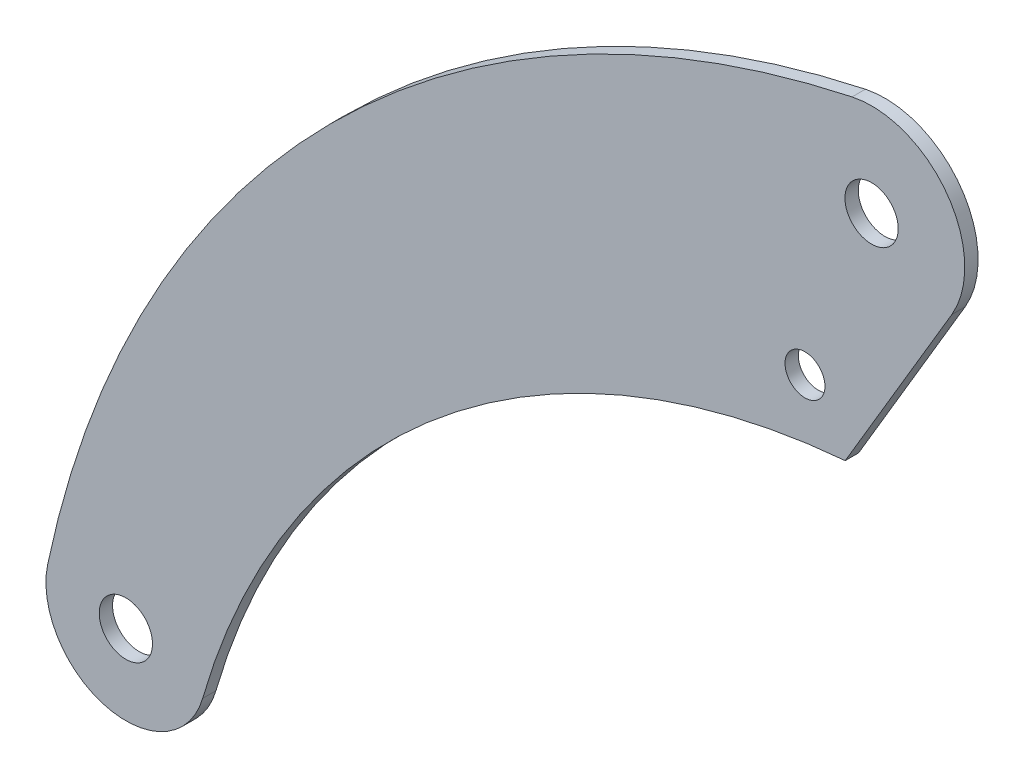
ISO-10303-21;
HEADER;
FILE_DESCRIPTION(('STEP AP214'),'2;1');
FILE_NAME('part.step','',(''),(''),'','','');
FILE_SCHEMA(('AUTOMOTIVE_DESIGN { 1 0 10303 214 1 1 1 1 }'));
ENDSEC;
DATA;
#1=APPLICATION_CONTEXT('core data for automotive mechanical design processes');
#2=APPLICATION_PROTOCOL_DEFINITION('international standard','automotive_design',2000,#1);
#3=PRODUCT_CONTEXT('',#1,'mechanical');
#4=PRODUCT('Part','Part','',(#3));
#5=PRODUCT_RELATED_PRODUCT_CATEGORY('part','',(#4));
#6=PRODUCT_DEFINITION_FORMATION('','',#4);
#7=PRODUCT_DEFINITION_CONTEXT('part definition',#1,'design');
#8=PRODUCT_DEFINITION('design','',#6,#7);
#9=PRODUCT_DEFINITION_SHAPE('','',#8);
#10=(LENGTH_UNIT() NAMED_UNIT(*) SI_UNIT(.MILLI.,.METRE.));
#11=(NAMED_UNIT(*) PLANE_ANGLE_UNIT() SI_UNIT($,.RADIAN.));
#12=(NAMED_UNIT(*) SI_UNIT($,.STERADIAN.) SOLID_ANGLE_UNIT());
#13=UNCERTAINTY_MEASURE_WITH_UNIT(LENGTH_MEASURE(1.E-05),#10,'distance_accuracy_value','');
#14=(GEOMETRIC_REPRESENTATION_CONTEXT(3) GLOBAL_UNCERTAINTY_ASSIGNED_CONTEXT((#13)) GLOBAL_UNIT_ASSIGNED_CONTEXT((#10,
#11,#12)) REPRESENTATION_CONTEXT('',''));
#15=CARTESIAN_POINT('',(0.,0.,0.));
#16=DIRECTION('',(0.,0.,1.));
#17=DIRECTION('',(1.,0.,0.));
#18=AXIS2_PLACEMENT_3D('',#15,#16,#17);
#19=CARTESIAN_POINT('',(149.481823007681,-699.199674335093,5.));
#20=DIRECTION('',(0.,0.,1.));
#21=DIRECTION('',(1.,0.,0.));
#22=AXIS2_PLACEMENT_3D('',#19,#20,#21);
#23=PLANE('',#22);
#24=CARTESIAN_POINT('',(-50.,-130.,5.));
#25=DIRECTION('',(0.,0.,1.));
#26=DIRECTION('',(1.,0.,0.));
#27=AXIS2_PLACEMENT_3D('',#24,#25,#26);
#28=CIRCLE('',#27,15.);
#29=CARTESIAN_POINT('',(-35.,-130.,5.));
#30=VERTEX_POINT('',#29);
#31=EDGE_CURVE('E173',#30,#30,#28,.T.);
#32=ORIENTED_EDGE('',*,*,#31,.F.);
#33=EDGE_LOOP('',(#32));
#34=FACE_BOUND('',#33,.T.);
#35=CARTESIAN_POINT('',(149.481823007681,-699.199674335093,5.));
#36=DIRECTION('',(0.,0.,1.));
#37=DIRECTION('',(1.,0.,0.));
#38=AXIS2_PLACEMENT_3D('',#35,#36,#37);
#39=CIRCLE('',#38,785.);
#40=CARTESIAN_POINT('',(-14.634584070682,68.4531149698693,5.));
#41=VERTEX_POINT('',#40);
#42=CARTESIAN_POINT('',(-618.715737076498,-537.652440744682,5.));
#43=VERTEX_POINT('',#42);
#44=EDGE_CURVE('E123',#41,#43,#39,.T.);
#45=ORIENTED_EDGE('',*,*,#44,.T.);
#46=CARTESIAN_POINT('',(-560.,-550.,5.));
#47=DIRECTION('',(0.,0.,1.));
#48=DIRECTION('',(1.,0.,0.));
#49=AXIS2_PLACEMENT_3D('',#46,#47,#48);
#50=CIRCLE('',#49,60.);
#51=CARTESIAN_POINT('',(-502.341900982989,-566.599506551236,5.));
#52=VERTEX_POINT('',#51);
#53=EDGE_CURVE('E90',#43,#52,#50,.T.);
#54=ORIENTED_EDGE('',*,*,#53,.T.);
#55=CARTESIAN_POINT('',(26.1906733396146,-718.761649937565,5.));
#56=DIRECTION('',(0.,0.,-1.));
#57=DIRECTION('',(1.,0.,0.));
#58=AXIS2_PLACEMENT_3D('',#55,#56,#57);
#59=CIRCLE('',#58,550.);
#60=CARTESIAN_POINT('',(-19.7795926456078,-170.686167321121,5.));
#61=VERTEX_POINT('',#60);
#62=EDGE_CURVE('E94',#52,#61,#59,.T.);
#63=ORIENTED_EDGE('',*,*,#62,.T.);
#64=DIRECTION('',(0.509802390301733,0.860291533634174,0.));
#65=VECTOR('',#64,1.);
#66=CARTESIAN_POINT('',(60.2204073543922,-35.6861673211213,5.));
#67=LINE('',#66,#65);
#68=CARTESIAN_POINT('',(60.2204073543922,-35.6861673211213,5.));
#69=VERTEX_POINT('',#68);
#70=EDGE_CURVE('E98',#61,#69,#67,.T.);
#71=ORIENTED_EDGE('',*,*,#70,.T.);
#72=CARTESIAN_POINT('',(0.,0.,5.));
#73=DIRECTION('',(0.,0.,1.));
#74=DIRECTION('',(-1.,0.,0.));
#75=AXIS2_PLACEMENT_3D('',#72,#73,#74);
#76=CIRCLE('',#75,70.);
#77=EDGE_CURVE('E56',#69,#41,#76,.T.);
#78=ORIENTED_EDGE('',*,*,#77,.T.);
#79=EDGE_LOOP('',(#45,#54,#63,#71,#78));
#80=FACE_BOUND('',#79,.T.);
#81=CARTESIAN_POINT('',(0.,0.,5.));
#82=DIRECTION('',(0.,0.,1.));
#83=DIRECTION('',(1.,0.,0.));
#84=AXIS2_PLACEMENT_3D('',#81,#82,#83);
#85=CIRCLE('',#84,20.);
#86=CARTESIAN_POINT('',(20.,0.,5.));
#87=VERTEX_POINT('',#86);
#88=EDGE_CURVE('E118',#87,#87,#85,.T.);
#89=ORIENTED_EDGE('',*,*,#88,.F.);
#90=EDGE_LOOP('',(#89));
#91=FACE_BOUND('',#90,.T.);
#92=CARTESIAN_POINT('',(-560.,-550.,5.));
#93=DIRECTION('',(0.,0.,1.));
#94=DIRECTION('',(1.,0.,0.));
#95=AXIS2_PLACEMENT_3D('',#92,#93,#94);
#96=CIRCLE('',#95,20.0000000000001);
#97=CARTESIAN_POINT('',(-540.,-550.,5.));
#98=VERTEX_POINT('',#97);
#99=EDGE_CURVE('E164',#98,#98,#96,.T.);
#100=ORIENTED_EDGE('',*,*,#99,.F.);
#101=EDGE_LOOP('',(#100));
#102=FACE_BOUND('',#101,.T.);
#103=ADVANCED_FACE('F39',(#34,#80,#91,#102),#23,.T.);
#104=CARTESIAN_POINT('',(149.481823007681,-699.199674335093,-5.));
#105=DIRECTION('',(0.,0.,1.));
#106=DIRECTION('',(1.,0.,0.));
#107=AXIS2_PLACEMENT_3D('',#104,#105,#106);
#108=PLANE('',#107);
#109=CARTESIAN_POINT('',(149.481823007681,-699.199674335093,-5.));
#110=DIRECTION('',(0.,0.,1.));
#111=DIRECTION('',(1.,0.,0.));
#112=AXIS2_PLACEMENT_3D('',#109,#110,#111);
#113=CIRCLE('',#112,785.);
#114=CARTESIAN_POINT('',(-14.634584070682,68.4531149698693,-5.));
#115=VERTEX_POINT('',#114);
#116=CARTESIAN_POINT('',(-618.715737076498,-537.652440744682,-5.));
#117=VERTEX_POINT('',#116);
#118=EDGE_CURVE('E114',#115,#117,#113,.T.);
#119=ORIENTED_EDGE('',*,*,#118,.F.);
#120=CARTESIAN_POINT('',(0.,0.,-5.));
#121=DIRECTION('',(0.,0.,1.));
#122=DIRECTION('',(-1.,0.,0.));
#123=AXIS2_PLACEMENT_3D('',#120,#121,#122);
#124=CIRCLE('',#123,70.);
#125=CARTESIAN_POINT('',(60.2204073543922,-35.6861673211213,-5.));
#126=VERTEX_POINT('',#125);
#127=EDGE_CURVE('E82',#126,#115,#124,.T.);
#128=ORIENTED_EDGE('',*,*,#127,.F.);
#129=DIRECTION('',(0.509802390301733,0.860291533634174,0.));
#130=VECTOR('',#129,1.);
#131=CARTESIAN_POINT('',(60.2204073543922,-35.6861673211213,-5.));
#132=LINE('',#131,#130);
#133=CARTESIAN_POINT('',(-19.7795926456078,-170.686167321121,-5.));
#134=VERTEX_POINT('',#133);
#135=EDGE_CURVE('E76',#134,#126,#132,.T.);
#136=ORIENTED_EDGE('',*,*,#135,.F.);
#137=CARTESIAN_POINT('',(26.1906733396146,-718.761649937565,-5.));
#138=DIRECTION('',(0.,0.,-1.));
#139=DIRECTION('',(1.,0.,0.));
#140=AXIS2_PLACEMENT_3D('',#137,#138,#139);
#141=CIRCLE('',#140,550.);
#142=CARTESIAN_POINT('',(-502.341900982989,-566.599506551236,-5.));
#143=VERTEX_POINT('',#142);
#144=EDGE_CURVE('E105',#143,#134,#141,.T.);
#145=ORIENTED_EDGE('',*,*,#144,.F.);
#146=CARTESIAN_POINT('',(-560.,-550.,-5.));
#147=DIRECTION('',(0.,0.,1.));
#148=DIRECTION('',(1.,0.,0.));
#149=AXIS2_PLACEMENT_3D('',#146,#147,#148);
#150=CIRCLE('',#149,60.);
#151=EDGE_CURVE('E117',#117,#143,#150,.T.);
#152=ORIENTED_EDGE('',*,*,#151,.F.);
#153=EDGE_LOOP('',(#119,#128,#136,#145,#152));
#154=FACE_BOUND('',#153,.T.);
#155=CARTESIAN_POINT('',(0.,0.,-5.));
#156=DIRECTION('',(0.,0.,1.));
#157=DIRECTION('',(1.,0.,0.));
#158=AXIS2_PLACEMENT_3D('',#155,#156,#157);
#159=CIRCLE('',#158,20.);
#160=CARTESIAN_POINT('',(20.,0.,-5.));
#161=VERTEX_POINT('',#160);
#162=EDGE_CURVE('E176',#161,#161,#159,.T.);
#163=ORIENTED_EDGE('',*,*,#162,.T.);
#164=EDGE_LOOP('',(#163));
#165=FACE_BOUND('',#164,.T.);
#166=CARTESIAN_POINT('',(-50.,-130.,-5.));
#167=DIRECTION('',(0.,0.,1.));
#168=DIRECTION('',(1.,0.,0.));
#169=AXIS2_PLACEMENT_3D('',#166,#167,#168);
#170=CIRCLE('',#169,15.);
#171=CARTESIAN_POINT('',(-35.,-130.,-5.));
#172=VERTEX_POINT('',#171);
#173=EDGE_CURVE('E170',#172,#172,#170,.T.);
#174=ORIENTED_EDGE('',*,*,#173,.T.);
#175=EDGE_LOOP('',(#174));
#176=FACE_BOUND('',#175,.T.);
#177=CARTESIAN_POINT('',(-560.,-550.,-5.));
#178=DIRECTION('',(0.,0.,1.));
#179=DIRECTION('',(1.,0.,0.));
#180=AXIS2_PLACEMENT_3D('',#177,#178,#179);
#181=CIRCLE('',#180,20.0000000000001);
#182=CARTESIAN_POINT('',(-540.,-550.,-5.));
#183=VERTEX_POINT('',#182);
#184=EDGE_CURVE('E167',#183,#183,#181,.T.);
#185=ORIENTED_EDGE('',*,*,#184,.T.);
#186=EDGE_LOOP('',(#185));
#187=FACE_BOUND('',#186,.T.);
#188=ADVANCED_FACE('F127',(#154,#165,#176,#187),#108,.F.);
#189=CARTESIAN_POINT('',(149.481823007681,-699.199674335093,5.));
#190=DIRECTION('',(0.,0.,-1.));
#191=DIRECTION('',(-1.,0.,0.));
#192=AXIS2_PLACEMENT_3D('',#189,#190,#191);
#193=CYLINDRICAL_SURFACE('',#192,785.);
#194=ORIENTED_EDGE('',*,*,#118,.T.);
#195=DIRECTION('',(0.,0.,-1.));
#196=VECTOR('',#195,1.);
#197=CARTESIAN_POINT('',(-618.715737076498,-537.652440744682,5.));
#198=LINE('',#197,#196);
#199=EDGE_CURVE('E11',#43,#117,#198,.T.);
#200=ORIENTED_EDGE('',*,*,#199,.F.);
#201=ORIENTED_EDGE('',*,*,#44,.F.);
#202=DIRECTION('',(0.,0.,-1.));
#203=VECTOR('',#202,1.);
#204=CARTESIAN_POINT('',(-14.634584070682,68.4531149698693,5.));
#205=LINE('',#204,#203);
#206=EDGE_CURVE('E110',#41,#115,#205,.T.);
#207=ORIENTED_EDGE('',*,*,#206,.T.);
#208=EDGE_LOOP('',(#194,#200,#201,#207));
#209=FACE_BOUND('',#208,.T.);
#210=ADVANCED_FACE('F41',(#209),#193,.T.);
#211=CARTESIAN_POINT('',(-560.,-550.,5.));
#212=DIRECTION('',(0.,0.,-1.));
#213=DIRECTION('',(-1.,0.,0.));
#214=AXIS2_PLACEMENT_3D('',#211,#212,#213);
#215=CYLINDRICAL_SURFACE('',#214,60.);
#216=ORIENTED_EDGE('',*,*,#151,.T.);
#217=DIRECTION('',(0.,0.,-1.));
#218=VECTOR('',#217,1.);
#219=CARTESIAN_POINT('',(-502.341900982989,-566.599506551236,5.));
#220=LINE('',#219,#218);
#221=EDGE_CURVE('E48',#52,#143,#220,.T.);
#222=ORIENTED_EDGE('',*,*,#221,.F.);
#223=ORIENTED_EDGE('',*,*,#53,.F.);
#224=ORIENTED_EDGE('',*,*,#199,.T.);
#225=EDGE_LOOP('',(#216,#222,#223,#224));
#226=FACE_BOUND('',#225,.T.);
#227=ADVANCED_FACE('F220',(#226),#215,.T.);
#228=CARTESIAN_POINT('',(26.1906733396146,-718.761649937565,5.));
#229=DIRECTION('',(0.,0.,-1.));
#230=DIRECTION('',(-1.,0.,0.));
#231=AXIS2_PLACEMENT_3D('',#228,#229,#230);
#232=CYLINDRICAL_SURFACE('',#231,550.);
#233=ORIENTED_EDGE('',*,*,#144,.T.);
#234=DIRECTION('',(0.,0.,-1.));
#235=VECTOR('',#234,1.);
#236=CARTESIAN_POINT('',(-19.7795926456078,-170.686167321121,5.));
#237=LINE('',#236,#235);
#238=EDGE_CURVE('E102',#61,#134,#237,.T.);
#239=ORIENTED_EDGE('',*,*,#238,.F.);
#240=ORIENTED_EDGE('',*,*,#62,.F.);
#241=ORIENTED_EDGE('',*,*,#221,.T.);
#242=EDGE_LOOP('',(#233,#239,#240,#241));
#243=FACE_BOUND('',#242,.T.);
#244=ADVANCED_FACE('F103',(#243),#232,.F.);
#245=CARTESIAN_POINT('',(60.2204073543922,-35.6861673211213,5.));
#246=DIRECTION('',(-0.860291533634174,0.509802390301733,0.));
#247=DIRECTION('',(-0.509802390301733,-0.860291533634174,0.));
#248=AXIS2_PLACEMENT_3D('',#245,#246,#247);
#249=PLANE('',#248);
#250=ORIENTED_EDGE('',*,*,#135,.T.);
#251=DIRECTION('',(0.,0.,-1.));
#252=VECTOR('',#251,1.);
#253=CARTESIAN_POINT('',(60.2204073543922,-35.6861673211213,5.));
#254=LINE('',#253,#252);
#255=EDGE_CURVE('E106',#69,#126,#254,.T.);
#256=ORIENTED_EDGE('',*,*,#255,.F.);
#257=ORIENTED_EDGE('',*,*,#70,.F.);
#258=ORIENTED_EDGE('',*,*,#238,.T.);
#259=EDGE_LOOP('',(#250,#256,#257,#258));
#260=FACE_BOUND('',#259,.T.);
#261=ADVANCED_FACE('F108',(#260),#249,.F.);
#262=CARTESIAN_POINT('',(0.,0.,5.));
#263=DIRECTION('',(0.,0.,-1.));
#264=DIRECTION('',(-1.,0.,0.));
#265=AXIS2_PLACEMENT_3D('',#262,#263,#264);
#266=CYLINDRICAL_SURFACE('',#265,70.);
#267=ORIENTED_EDGE('',*,*,#127,.T.);
#268=ORIENTED_EDGE('',*,*,#206,.F.);
#269=ORIENTED_EDGE('',*,*,#77,.F.);
#270=ORIENTED_EDGE('',*,*,#255,.T.);
#271=EDGE_LOOP('',(#267,#268,#269,#270));
#272=FACE_BOUND('',#271,.T.);
#273=ADVANCED_FACE('F132',(#272),#266,.T.);
#274=CARTESIAN_POINT('',(0.,0.,5.));
#275=DIRECTION('',(0.,0.,-1.));
#276=DIRECTION('',(-1.,0.,0.));
#277=AXIS2_PLACEMENT_3D('',#274,#275,#276);
#278=CYLINDRICAL_SURFACE('',#277,20.);
#279=ORIENTED_EDGE('',*,*,#88,.T.);
#280=EDGE_LOOP('',(#279));
#281=FACE_BOUND('',#280,.T.);
#282=ORIENTED_EDGE('',*,*,#162,.F.);
#283=EDGE_LOOP('',(#282));
#284=FACE_BOUND('',#283,.T.);
#285=ADVANCED_FACE('F134',(#281,#284),#278,.F.);
#286=CARTESIAN_POINT('',(-50.,-130.,5.));
#287=DIRECTION('',(0.,0.,-1.));
#288=DIRECTION('',(-1.,0.,0.));
#289=AXIS2_PLACEMENT_3D('',#286,#287,#288);
#290=CYLINDRICAL_SURFACE('',#289,15.);
#291=ORIENTED_EDGE('',*,*,#31,.T.);
#292=EDGE_LOOP('',(#291));
#293=FACE_BOUND('',#292,.T.);
#294=ORIENTED_EDGE('',*,*,#173,.F.);
#295=EDGE_LOOP('',(#294));
#296=FACE_BOUND('',#295,.T.);
#297=ADVANCED_FACE('F140',(#293,#296),#290,.F.);
#298=CARTESIAN_POINT('',(-560.,-550.,5.));
#299=DIRECTION('',(0.,0.,-1.));
#300=DIRECTION('',(-1.,0.,0.));
#301=AXIS2_PLACEMENT_3D('',#298,#299,#300);
#302=CYLINDRICAL_SURFACE('',#301,20.0000000000001);
#303=ORIENTED_EDGE('',*,*,#99,.T.);
#304=EDGE_LOOP('',(#303));
#305=FACE_BOUND('',#304,.T.);
#306=ORIENTED_EDGE('',*,*,#184,.F.);
#307=EDGE_LOOP('',(#306));
#308=FACE_BOUND('',#307,.T.);
#309=ADVANCED_FACE('F155',(#305,#308),#302,.F.);
#310=CLOSED_SHELL('',(#103,#188,#210,#227,#244,#261,#273,#285,#297,#309));
#311=MANIFOLD_SOLID_BREP('B2',#310);
#312=ADVANCED_BREP_SHAPE_REPRESENTATION('',(#18,#311),#14);
#313=SHAPE_DEFINITION_REPRESENTATION(#9,#312);
ENDSEC;
END-ISO-10303-21;
